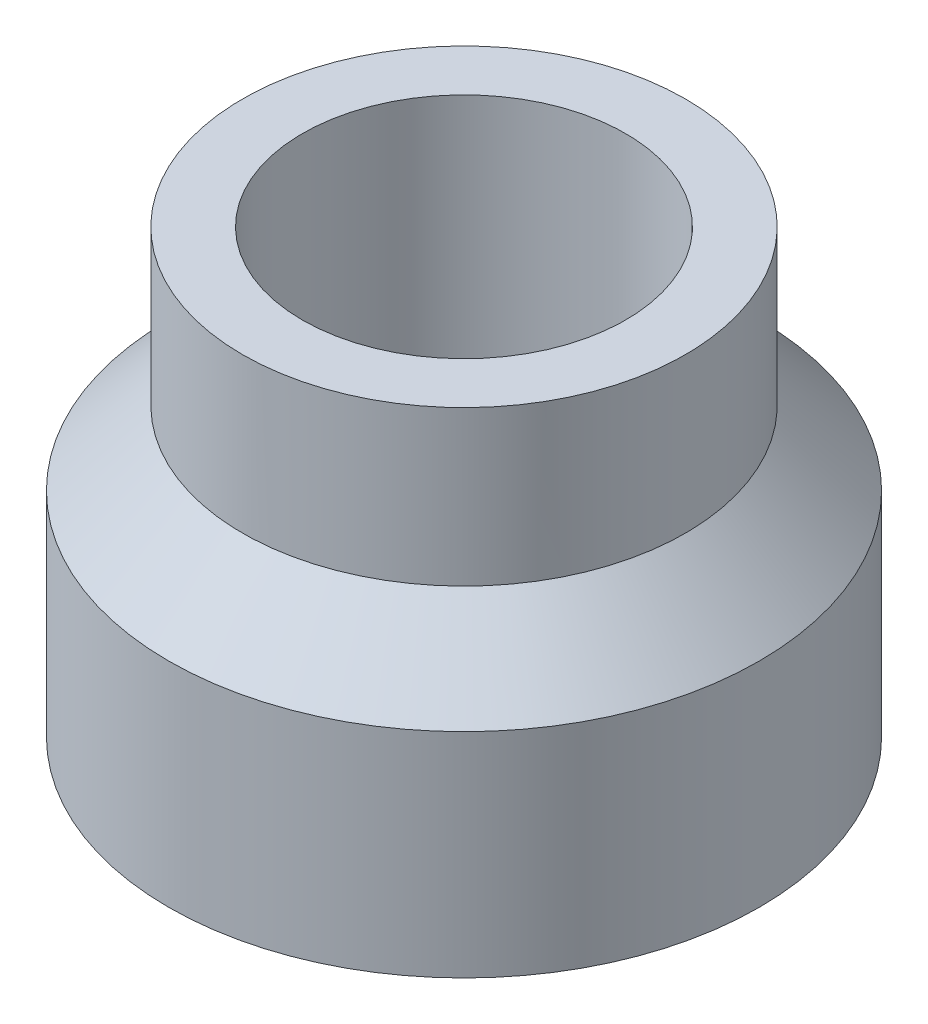
ISO-10303-21;
HEADER;
FILE_DESCRIPTION(('STEP AP214'),'2;1');
FILE_NAME('part.step','',(''),(''),'','','');
FILE_SCHEMA(('AUTOMOTIVE_DESIGN { 1 0 10303 214 1 1 1 1 }'));
ENDSEC;
DATA;
#1=APPLICATION_CONTEXT('core data for automotive mechanical design processes');
#2=APPLICATION_PROTOCOL_DEFINITION('international standard','automotive_design',2000,#1);
#3=PRODUCT_CONTEXT('',#1,'mechanical');
#4=PRODUCT('Part','Part','',(#3));
#5=PRODUCT_RELATED_PRODUCT_CATEGORY('part','',(#4));
#6=PRODUCT_DEFINITION_FORMATION('','',#4);
#7=PRODUCT_DEFINITION_CONTEXT('part definition',#1,'design');
#8=PRODUCT_DEFINITION('design','',#6,#7);
#9=PRODUCT_DEFINITION_SHAPE('','',#8);
#10=(LENGTH_UNIT() NAMED_UNIT(*) SI_UNIT(.MILLI.,.METRE.));
#11=(NAMED_UNIT(*) PLANE_ANGLE_UNIT() SI_UNIT($,.RADIAN.));
#12=(NAMED_UNIT(*) SI_UNIT($,.STERADIAN.) SOLID_ANGLE_UNIT());
#13=UNCERTAINTY_MEASURE_WITH_UNIT(LENGTH_MEASURE(1.E-05),#10,'distance_accuracy_value','');
#14=(GEOMETRIC_REPRESENTATION_CONTEXT(3) GLOBAL_UNCERTAINTY_ASSIGNED_CONTEXT((#13)) GLOBAL_UNIT_ASSIGNED_CONTEXT((#10,
#11,#12)) REPRESENTATION_CONTEXT('',''));
#15=CARTESIAN_POINT('',(0.,0.,0.));
#16=DIRECTION('',(0.,0.,1.));
#17=DIRECTION('',(1.,0.,0.));
#18=AXIS2_PLACEMENT_3D('',#15,#16,#17);
#19=CARTESIAN_POINT('',(0.,3.175,0.));
#20=DIRECTION('',(0.,-1.,0.));
#21=DIRECTION('',(0.,0.,-1.));
#22=AXIS2_PLACEMENT_3D('',#19,#20,#21);
#23=CYLINDRICAL_SURFACE('',#22,6.35);
#24=CARTESIAN_POINT('',(0.,4.58750000000004,0.));
#25=DIRECTION('',(0.,-1.,0.));
#26=DIRECTION('',(0.,0.,-1.));
#27=AXIS2_PLACEMENT_3D('',#24,#25,#26);
#28=CIRCLE('',#27,6.35);
#29=CARTESIAN_POINT('',(0.,4.58750000000004,-6.35));
#30=VERTEX_POINT('',#29);
#31=EDGE_CURVE('E10',#30,#30,#28,.T.);
#32=ORIENTED_EDGE('',*,*,#31,.T.);
#33=EDGE_LOOP('',(#32));
#34=FACE_BOUND('',#33,.T.);
#35=CARTESIAN_POINT('',(0.,0.,0.));
#36=DIRECTION('',(0.,1.,0.));
#37=DIRECTION('',(0.,0.,1.));
#38=AXIS2_PLACEMENT_3D('',#35,#36,#37);
#39=CIRCLE('',#38,6.35);
#40=CARTESIAN_POINT('',(0.,0.,6.35));
#41=VERTEX_POINT('',#40);
#42=EDGE_CURVE('E41',#41,#41,#39,.T.);
#43=ORIENTED_EDGE('',*,*,#42,.T.);
#44=EDGE_LOOP('',(#43));
#45=FACE_BOUND('',#44,.T.);
#46=ADVANCED_FACE('F30',(#34,#45),#23,.T.);
#47=CARTESIAN_POINT('',(0.,0.,0.));
#48=DIRECTION('',(0.,1.,0.));
#49=DIRECTION('',(0.,0.,1.));
#50=AXIS2_PLACEMENT_3D('',#47,#48,#49);
#51=PLANE('',#50);
#52=ORIENTED_EDGE('',*,*,#42,.F.);
#53=EDGE_LOOP('',(#52));
#54=FACE_BOUND('',#53,.T.);
#55=CARTESIAN_POINT('',(0.,0.,0.));
#56=DIRECTION('',(0.,1.,0.));
#57=DIRECTION('',(0.,0.,1.));
#58=AXIS2_PLACEMENT_3D('',#55,#56,#57);
#59=CIRCLE('',#58,3.475);
#60=CARTESIAN_POINT('',(0.,0.,3.475));
#61=VERTEX_POINT('',#60);
#62=EDGE_CURVE('E48',#61,#61,#59,.T.);
#63=ORIENTED_EDGE('',*,*,#62,.T.);
#64=EDGE_LOOP('',(#63));
#65=FACE_BOUND('',#64,.T.);
#66=ADVANCED_FACE('F72',(#54,#65),#51,.F.);
#67=CARTESIAN_POINT('',(0.,9.5,0.));
#68=DIRECTION('',(0.,-1.,0.));
#69=DIRECTION('',(0.,0.,-1.));
#70=AXIS2_PLACEMENT_3D('',#67,#68,#69);
#71=CYLINDRICAL_SURFACE('',#70,3.475);
#72=CARTESIAN_POINT('',(0.,9.5,0.));
#73=DIRECTION('',(0.,1.,0.));
#74=DIRECTION('',(0.,0.,1.));
#75=AXIS2_PLACEMENT_3D('',#72,#73,#74);
#76=CIRCLE('',#75,3.475);
#77=CARTESIAN_POINT('',(0.,9.5,3.475));
#78=VERTEX_POINT('',#77);
#79=EDGE_CURVE('E51',#78,#78,#76,.T.);
#80=ORIENTED_EDGE('',*,*,#79,.T.);
#81=EDGE_LOOP('',(#80));
#82=FACE_BOUND('',#81,.T.);
#83=ORIENTED_EDGE('',*,*,#62,.F.);
#84=EDGE_LOOP('',(#83));
#85=FACE_BOUND('',#84,.T.);
#86=ADVANCED_FACE('F57',(#82,#85),#71,.F.);
#87=CARTESIAN_POINT('',(0.,9.5,0.));
#88=DIRECTION('',(0.,-1.,0.));
#89=DIRECTION('',(0.,0.,-1.));
#90=AXIS2_PLACEMENT_3D('',#87,#88,#89);
#91=CYLINDRICAL_SURFACE('',#90,4.7625);
#92=CARTESIAN_POINT('',(0.,6.17500000000005,0.));
#93=DIRECTION('',(0.,1.,0.));
#94=DIRECTION('',(0.,0.,1.));
#95=AXIS2_PLACEMENT_3D('',#92,#93,#94);
#96=CIRCLE('',#95,4.7625);
#97=CARTESIAN_POINT('',(0.,6.17500000000005,-4.7625));
#98=VERTEX_POINT('',#97);
#99=EDGE_CURVE('E37',#98,#98,#96,.T.);
#100=ORIENTED_EDGE('',*,*,#99,.T.);
#101=EDGE_LOOP('',(#100));
#102=FACE_BOUND('',#101,.T.);
#103=CARTESIAN_POINT('',(0.,9.5,0.));
#104=DIRECTION('',(0.,1.,0.));
#105=DIRECTION('',(0.,0.,1.));
#106=AXIS2_PLACEMENT_3D('',#103,#104,#105);
#107=CIRCLE('',#106,4.7625);
#108=CARTESIAN_POINT('',(0.,9.5,4.7625));
#109=VERTEX_POINT('',#108);
#110=EDGE_CURVE('E45',#109,#109,#107,.T.);
#111=ORIENTED_EDGE('',*,*,#110,.F.);
#112=EDGE_LOOP('',(#111));
#113=FACE_BOUND('',#112,.T.);
#114=ADVANCED_FACE('F63',(#102,#113),#91,.T.);
#115=CARTESIAN_POINT('',(0.,9.5,0.));
#116=DIRECTION('',(0.,1.,0.));
#117=DIRECTION('',(0.,0.,1.));
#118=AXIS2_PLACEMENT_3D('',#115,#116,#117);
#119=PLANE('',#118);
#120=ORIENTED_EDGE('',*,*,#79,.F.);
#121=EDGE_LOOP('',(#120));
#122=FACE_BOUND('',#121,.T.);
#123=ORIENTED_EDGE('',*,*,#110,.T.);
#124=EDGE_LOOP('',(#123));
#125=FACE_BOUND('',#124,.T.);
#126=ADVANCED_FACE('F60',(#122,#125),#119,.T.);
#127=CARTESIAN_POINT('',(0.,6.17500000000005,0.));
#128=DIRECTION('',(0.,-1.,0.));
#129=DIRECTION('',(0.,0.,-1.));
#130=AXIS2_PLACEMENT_3D('',#127,#128,#129);
#131=CONICAL_SURFACE('',#130,4.7625,0.785398163397443);
#132=CARTESIAN_POINT('',(0.,4.58750000000004,-6.35));
#133=CARTESIAN_POINT('',(0.,4.60403645833337,-6.33346354166667));
#134=CARTESIAN_POINT('',(0.,4.6205729166667,-6.31692708333333));
#135=CARTESIAN_POINT('',(0.,4.65364583333337,-6.28385416666667));
#136=CARTESIAN_POINT('',(0.,4.6701822916667,-6.26731770833333));
#137=CARTESIAN_POINT('',(0.,4.70325520833337,-6.23424479166667));
#138=CARTESIAN_POINT('',(0.,4.7197916666667,-6.21770833333333));
#139=CARTESIAN_POINT('',(0.,4.75286458333337,-6.18463541666667));
#140=CARTESIAN_POINT('',(0.,4.7694010416667,-6.16809895833333));
#141=CARTESIAN_POINT('',(0.,4.80247395833337,-6.13502604166667));
#142=CARTESIAN_POINT('',(0.,4.81901041666671,-6.11848958333333));
#143=CARTESIAN_POINT('',(0.,4.85208333333337,-6.08541666666667));
#144=CARTESIAN_POINT('',(0.,4.86861979166671,-6.06888020833333));
#145=CARTESIAN_POINT('',(0.,4.90169270833337,-6.03580729166667));
#146=CARTESIAN_POINT('',(0.,4.91822916666671,-6.01927083333333));
#147=CARTESIAN_POINT('',(0.,4.95130208333337,-5.98619791666667));
#148=CARTESIAN_POINT('',(0.,4.96783854166671,-5.96966145833333));
#149=CARTESIAN_POINT('',(0.,5.00091145833337,-5.93658854166667));
#150=CARTESIAN_POINT('',(0.,5.01744791666671,-5.92005208333333));
#151=CARTESIAN_POINT('',(0.,5.05052083333337,-5.88697916666667));
#152=CARTESIAN_POINT('',(0.,5.06705729166671,-5.87044270833333));
#153=CARTESIAN_POINT('',(0.,5.10013020833337,-5.83736979166667));
#154=CARTESIAN_POINT('',(0.,5.11666666666671,-5.82083333333333));
#155=CARTESIAN_POINT('',(0.,5.14973958333337,-5.78776041666667));
#156=CARTESIAN_POINT('',(0.,5.16627604166671,-5.77122395833333));
#157=CARTESIAN_POINT('',(0.,5.19934895833338,-5.73815104166667));
#158=CARTESIAN_POINT('',(0.,5.21588541666671,-5.72161458333333));
#159=CARTESIAN_POINT('',(0.,5.24895833333338,-5.68854166666667));
#160=CARTESIAN_POINT('',(0.,5.26549479166671,-5.67200520833333));
#161=CARTESIAN_POINT('',(0.,5.29856770833338,-5.63893229166667));
#162=CARTESIAN_POINT('',(0.,5.31510416666671,-5.62239583333333));
#163=CARTESIAN_POINT('',(0.,5.34817708333338,-5.58932291666667));
#164=CARTESIAN_POINT('',(0.,5.36471354166671,-5.57278645833333));
#165=CARTESIAN_POINT('',(0.,5.39778645833338,-5.53971354166667));
#166=CARTESIAN_POINT('',(0.,5.41432291666671,-5.52317708333333));
#167=CARTESIAN_POINT('',(0.,5.44739583333338,-5.49010416666667));
#168=CARTESIAN_POINT('',(0.,5.46393229166671,-5.47356770833333));
#169=CARTESIAN_POINT('',(0.,5.49700520833338,-5.44049479166667));
#170=CARTESIAN_POINT('',(0.,5.51354166666671,-5.42395833333333));
#171=CARTESIAN_POINT('',(0.,5.54661458333338,-5.39088541666667));
#172=CARTESIAN_POINT('',(0.,5.56315104166671,-5.37434895833333));
#173=CARTESIAN_POINT('',(0.,5.59622395833338,-5.34127604166667));
#174=CARTESIAN_POINT('',(0.,5.61276041666671,-5.32473958333333));
#175=CARTESIAN_POINT('',(0.,5.64583333333338,-5.29166666666667));
#176=CARTESIAN_POINT('',(0.,5.66236979166671,-5.27513020833333));
#177=CARTESIAN_POINT('',(0.,5.69544270833338,-5.24205729166667));
#178=CARTESIAN_POINT('',(0.,5.71197916666671,-5.22552083333333));
#179=CARTESIAN_POINT('',(0.,5.74505208333338,-5.19244791666667));
#180=CARTESIAN_POINT('',(0.,5.76158854166671,-5.17591145833333));
#181=CARTESIAN_POINT('',(0.,5.79466145833338,-5.14283854166667));
#182=CARTESIAN_POINT('',(0.,5.81119791666671,-5.12630208333333));
#183=CARTESIAN_POINT('',(0.,5.84427083333338,-5.09322916666667));
#184=CARTESIAN_POINT('',(0.,5.86080729166672,-5.07669270833333));
#185=CARTESIAN_POINT('',(0.,5.89388020833338,-5.04361979166667));
#186=CARTESIAN_POINT('',(0.,5.91041666666672,-5.02708333333333));
#187=CARTESIAN_POINT('',(0.,5.94348958333338,-4.99401041666667));
#188=CARTESIAN_POINT('',(0.,5.96002604166672,-4.97747395833333));
#189=CARTESIAN_POINT('',(0.,5.99309895833338,-4.94440104166667));
#190=CARTESIAN_POINT('',(0.,6.00963541666672,-4.92786458333333));
#191=CARTESIAN_POINT('',(0.,6.04270833333338,-4.89479166666667));
#192=CARTESIAN_POINT('',(0.,6.05924479166672,-4.87825520833333));
#193=CARTESIAN_POINT('',(0.,6.09231770833338,-4.84518229166667));
#194=CARTESIAN_POINT('',(0.,6.10885416666672,-4.82864583333333));
#195=CARTESIAN_POINT('',(0.,6.14192708333338,-4.79557291666667));
#196=CARTESIAN_POINT('',(0.,6.15846354166672,-4.77903645833333));
#197=CARTESIAN_POINT('',(0.,6.17500000000005,-4.7625));
#198=B_SPLINE_CURVE_WITH_KNOTS('',3,(#132,#133,#134,#135,#136,#137,#138,#139,#140,#141,#142,
#143,#144,#145,#146,#147,#148,#149,#150,#151,#152,#153,#154,#155,#156,#157,#158,#159,#160,#161,
#162,#163,#164,#165,#166,#167,#168,#169,#170,#171,#172,#173,#174,#175,#176,#177,#178,#179,#180,
#181,#182,#183,#184,#185,#186,#187,#188,#189,#190,#191,#192,#193,#194,#195,#196,#197),
.UNSPECIFIED.,.F.,.F.,(4,2,2,2,2,2,2,2,2,2,2,2,2,2,2,2,2,2,2,2,2,2,2,2,2,2,2,2,2,2,2,2,4),(0.,
0.070158250945853,0.140316501891706,0.210474752837559,0.280633003783413,0.350791254729266,
0.420949505675119,0.491107756620972,0.561266007566825,0.631424258512678,0.701582509458531,
0.771740760404384,0.841899011350237,0.91205726229609,0.982215513241943,1.0523737641878,
1.12253201513365,1.1926902660795,1.26284851702536,1.33300676797121,1.40316501891706,
1.47332326986291,1.54348152080877,1.61363977175462,1.68379802270047,1.75395627364633,
1.82411452459218,1.89427277553803,1.96443102648388,2.03458927742974,2.10474752837559,
2.17490577932144,2.2450640302673),.UNSPECIFIED.);
#199=EDGE_CURVE('BSEAM32',#30,#98,#198,.T.);
#200=ORIENTED_EDGE('',*,*,#31,.F.);
#201=ORIENTED_EDGE('',*,*,#99,.F.);
#202=ORIENTED_EDGE('',*,*,#199,.T.);
#203=ORIENTED_EDGE('',*,*,#199,.F.);
#204=EDGE_LOOP('',(#200,#202,#201,#203));
#205=FACE_BOUND('',#204,.T.);
#206=ADVANCED_FACE('F32',(#205),#131,.T.);
#207=CLOSED_SHELL('',(#46,#66,#86,#114,#126,#206));
#208=MANIFOLD_SOLID_BREP('B2',#207);
#209=ADVANCED_BREP_SHAPE_REPRESENTATION('',(#18,#208),#14);
#210=SHAPE_DEFINITION_REPRESENTATION(#9,#209);
ENDSEC;
END-ISO-10303-21;
